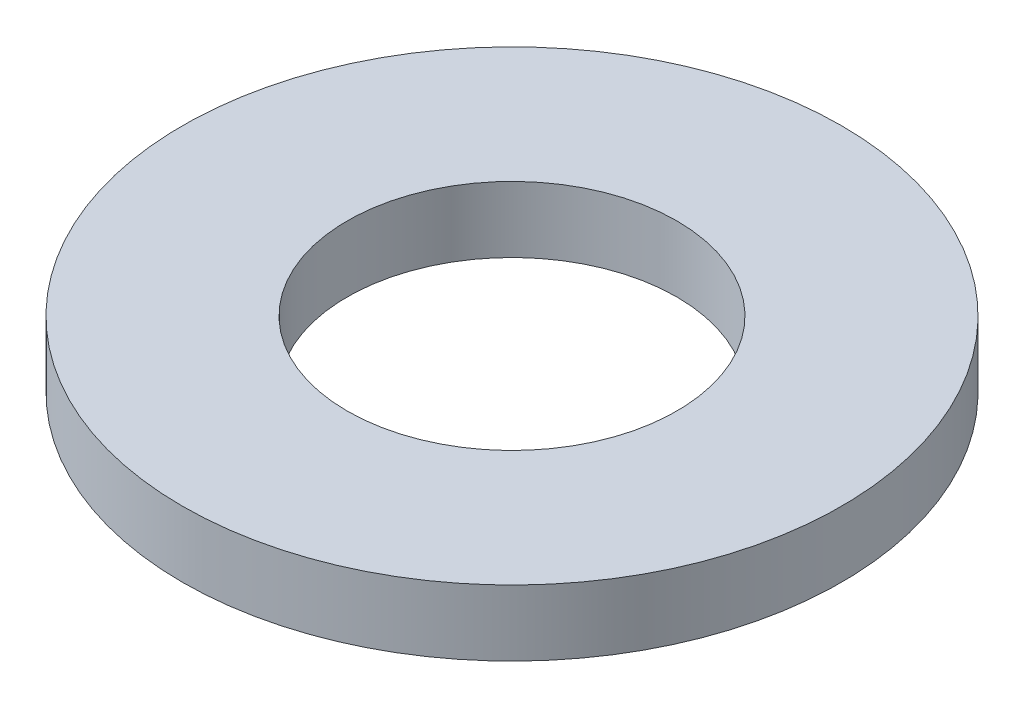
ISO-10303-21;
HEADER;
FILE_DESCRIPTION(('STEP AP214'),'2;1');
FILE_NAME('part.step','',(''),(''),'','','');
FILE_SCHEMA(('AUTOMOTIVE_DESIGN { 1 0 10303 214 1 1 1 1 }'));
ENDSEC;
DATA;
#1=APPLICATION_CONTEXT('core data for automotive mechanical design processes');
#2=APPLICATION_PROTOCOL_DEFINITION('international standard','automotive_design',2000,#1);
#3=PRODUCT_CONTEXT('',#1,'mechanical');
#4=PRODUCT('Part','Part','',(#3));
#5=PRODUCT_RELATED_PRODUCT_CATEGORY('part','',(#4));
#6=PRODUCT_DEFINITION_FORMATION('','',#4);
#7=PRODUCT_DEFINITION_CONTEXT('part definition',#1,'design');
#8=PRODUCT_DEFINITION('design','',#6,#7);
#9=PRODUCT_DEFINITION_SHAPE('','',#8);
#10=(LENGTH_UNIT() NAMED_UNIT(*) SI_UNIT(.MILLI.,.METRE.));
#11=(NAMED_UNIT(*) PLANE_ANGLE_UNIT() SI_UNIT($,.RADIAN.));
#12=(NAMED_UNIT(*) SI_UNIT($,.STERADIAN.) SOLID_ANGLE_UNIT());
#13=UNCERTAINTY_MEASURE_WITH_UNIT(LENGTH_MEASURE(1.E-05),#10,'distance_accuracy_value','');
#14=(GEOMETRIC_REPRESENTATION_CONTEXT(3) GLOBAL_UNCERTAINTY_ASSIGNED_CONTEXT((#13)) GLOBAL_UNIT_ASSIGNED_CONTEXT((#10,
#11,#12)) REPRESENTATION_CONTEXT('',''));
#15=CARTESIAN_POINT('',(0.,0.,0.));
#16=DIRECTION('',(0.,0.,1.));
#17=DIRECTION('',(1.,0.,0.));
#18=AXIS2_PLACEMENT_3D('',#15,#16,#17);
#19=CARTESIAN_POINT('',(0.,1.6,0.));
#20=DIRECTION('',(0.,1.,0.));
#21=DIRECTION('',(0.,0.,1.));
#22=AXIS2_PLACEMENT_3D('',#19,#20,#21);
#23=PLANE('',#22);
#24=CARTESIAN_POINT('',(0.,1.6,0.));
#25=DIRECTION('',(0.,1.,0.));
#26=DIRECTION('',(0.,0.,1.));
#27=AXIS2_PLACEMENT_3D('',#24,#25,#26);
#28=CIRCLE('',#27,8.);
#29=CARTESIAN_POINT('',(0.,1.6,8.));
#30=VERTEX_POINT('',#29);
#31=EDGE_CURVE('E10',#30,#30,#28,.T.);
#32=ORIENTED_EDGE('',*,*,#31,.T.);
#33=EDGE_LOOP('',(#32));
#34=FACE_BOUND('',#33,.T.);
#35=CARTESIAN_POINT('',(0.,1.6,0.));
#36=DIRECTION('',(0.,1.,0.));
#37=DIRECTION('',(0.,0.,1.));
#38=AXIS2_PLACEMENT_3D('',#35,#36,#37);
#39=CIRCLE('',#38,4.);
#40=CARTESIAN_POINT('',(0.,1.6,4.));
#41=VERTEX_POINT('',#40);
#42=EDGE_CURVE('E54',#41,#41,#39,.T.);
#43=ORIENTED_EDGE('',*,*,#42,.F.);
#44=EDGE_LOOP('',(#43));
#45=FACE_BOUND('',#44,.T.);
#46=ADVANCED_FACE('F41',(#34,#45),#23,.T.);
#47=CARTESIAN_POINT('',(0.,0.,0.));
#48=DIRECTION('',(0.,1.,0.));
#49=DIRECTION('',(0.,0.,1.));
#50=AXIS2_PLACEMENT_3D('',#47,#48,#49);
#51=PLANE('',#50);
#52=CARTESIAN_POINT('',(0.,0.,0.));
#53=DIRECTION('',(0.,1.,0.));
#54=DIRECTION('',(0.,0.,1.));
#55=AXIS2_PLACEMENT_3D('',#52,#53,#54);
#56=CIRCLE('',#55,8.);
#57=CARTESIAN_POINT('',(0.,0.,8.));
#58=VERTEX_POINT('',#57);
#59=EDGE_CURVE('E45',#58,#58,#56,.T.);
#60=ORIENTED_EDGE('',*,*,#59,.F.);
#61=EDGE_LOOP('',(#60));
#62=FACE_BOUND('',#61,.T.);
#63=CARTESIAN_POINT('',(0.,0.,0.));
#64=DIRECTION('',(0.,1.,0.));
#65=DIRECTION('',(0.,0.,1.));
#66=AXIS2_PLACEMENT_3D('',#63,#64,#65);
#67=CIRCLE('',#66,4.);
#68=CARTESIAN_POINT('',(0.,0.,4.));
#69=VERTEX_POINT('',#68);
#70=EDGE_CURVE('E56',#69,#69,#67,.T.);
#71=ORIENTED_EDGE('',*,*,#70,.T.);
#72=EDGE_LOOP('',(#71));
#73=FACE_BOUND('',#72,.T.);
#74=ADVANCED_FACE('F68',(#62,#73),#51,.F.);
#75=CARTESIAN_POINT('',(0.,1.6,0.));
#76=DIRECTION('',(0.,-1.,0.));
#77=DIRECTION('',(0.,0.,-1.));
#78=AXIS2_PLACEMENT_3D('',#75,#76,#77);
#79=CYLINDRICAL_SURFACE('',#78,8.);
#80=ORIENTED_EDGE('',*,*,#31,.F.);
#81=EDGE_LOOP('',(#80));
#82=FACE_BOUND('',#81,.T.);
#83=ORIENTED_EDGE('',*,*,#59,.T.);
#84=EDGE_LOOP('',(#83));
#85=FACE_BOUND('',#84,.T.);
#86=ADVANCED_FACE('F43',(#82,#85),#79,.T.);
#87=CARTESIAN_POINT('',(0.,1.6,0.));
#88=DIRECTION('',(0.,-1.,0.));
#89=DIRECTION('',(0.,0.,-1.));
#90=AXIS2_PLACEMENT_3D('',#87,#88,#89);
#91=CYLINDRICAL_SURFACE('',#90,4.);
#92=ORIENTED_EDGE('',*,*,#42,.T.);
#93=EDGE_LOOP('',(#92));
#94=FACE_BOUND('',#93,.T.);
#95=ORIENTED_EDGE('',*,*,#70,.F.);
#96=EDGE_LOOP('',(#95));
#97=FACE_BOUND('',#96,.T.);
#98=ADVANCED_FACE('F64',(#94,#97),#91,.F.);
#99=CLOSED_SHELL('',(#46,#74,#86,#98));
#100=MANIFOLD_SOLID_BREP('B2',#99);
#101=ADVANCED_BREP_SHAPE_REPRESENTATION('',(#18,#100),#14);
#102=SHAPE_DEFINITION_REPRESENTATION(#9,#101);
ENDSEC;
END-ISO-10303-21;
